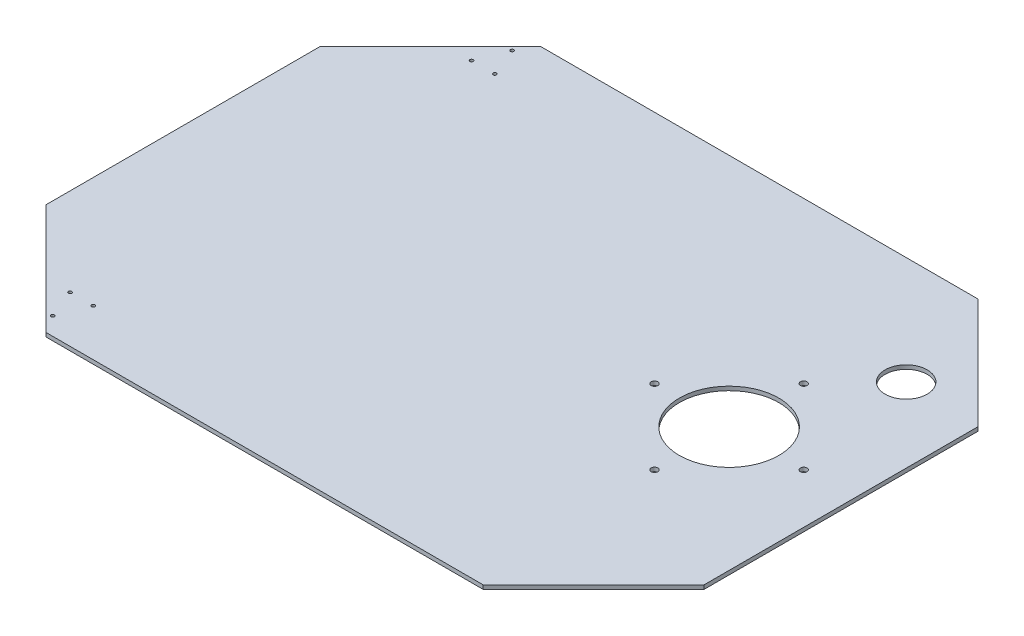
ISO-10303-21;
HEADER;
FILE_DESCRIPTION(('STEP AP214'),'2;1');
FILE_NAME('part.step','',(''),(''),'','','');
FILE_SCHEMA(('AUTOMOTIVE_DESIGN { 1 0 10303 214 1 1 1 1 }'));
ENDSEC;
DATA;
#1=APPLICATION_CONTEXT('core data for automotive mechanical design processes');
#2=APPLICATION_PROTOCOL_DEFINITION('international standard','automotive_design',2000,#1);
#3=PRODUCT_CONTEXT('',#1,'mechanical');
#4=PRODUCT('Part','Part','',(#3));
#5=PRODUCT_RELATED_PRODUCT_CATEGORY('part','',(#4));
#6=PRODUCT_DEFINITION_FORMATION('','',#4);
#7=PRODUCT_DEFINITION_CONTEXT('part definition',#1,'design');
#8=PRODUCT_DEFINITION('design','',#6,#7);
#9=PRODUCT_DEFINITION_SHAPE('','',#8);
#10=(LENGTH_UNIT() NAMED_UNIT(*) SI_UNIT(.MILLI.,.METRE.));
#11=(NAMED_UNIT(*) PLANE_ANGLE_UNIT() SI_UNIT($,.RADIAN.));
#12=(NAMED_UNIT(*) SI_UNIT($,.STERADIAN.) SOLID_ANGLE_UNIT());
#13=UNCERTAINTY_MEASURE_WITH_UNIT(LENGTH_MEASURE(1.E-05),#10,'distance_accuracy_value','');
#14=(GEOMETRIC_REPRESENTATION_CONTEXT(3) GLOBAL_UNCERTAINTY_ASSIGNED_CONTEXT((#13)) GLOBAL_UNIT_ASSIGNED_CONTEXT((#10,
#11,#12)) REPRESENTATION_CONTEXT('',''));
#15=CARTESIAN_POINT('',(0.,0.,0.));
#16=DIRECTION('',(0.,0.,1.));
#17=DIRECTION('',(1.,0.,0.));
#18=AXIS2_PLACEMENT_3D('',#15,#16,#17);
#19=CARTESIAN_POINT('',(-198.4375,2.38125,-149.225));
#20=DIRECTION('',(1.,0.,0.));
#21=DIRECTION('',(0.,0.,-1.));
#22=AXIS2_PLACEMENT_3D('',#19,#20,#21);
#23=PLANE('',#22);
#24=DIRECTION('',(0.,1.,0.));
#25=VECTOR('',#24,1.);
#26=CARTESIAN_POINT('',(-198.4375,-7.61875,-82.55));
#27=LINE('',#26,#25);
#28=CARTESIAN_POINT('',(-198.4375,0.,-82.55));
#29=VERTEX_POINT('',#28);
#30=CARTESIAN_POINT('',(-198.4375,2.38125,-82.55));
#31=VERTEX_POINT('',#30);
#32=EDGE_CURVE('E98',#29,#31,#27,.T.);
#33=ORIENTED_EDGE('',*,*,#32,.F.);
#34=DIRECTION('',(0.,0.,1.));
#35=VECTOR('',#34,1.);
#36=CARTESIAN_POINT('',(-198.4375,0.,-149.225));
#37=LINE('',#36,#35);
#38=CARTESIAN_POINT('',(-198.4375,0.,82.55));
#39=VERTEX_POINT('',#38);
#40=EDGE_CURVE('E57',#29,#39,#37,.T.);
#41=ORIENTED_EDGE('',*,*,#40,.T.);
#42=DIRECTION('',(0.,1.,0.));
#43=VECTOR('',#42,1.);
#44=CARTESIAN_POINT('',(-198.4375,-7.61875,82.55));
#45=LINE('',#44,#43);
#46=CARTESIAN_POINT('',(-198.4375,2.38125,82.55));
#47=VERTEX_POINT('',#46);
#48=EDGE_CURVE('E114',#39,#47,#45,.T.);
#49=ORIENTED_EDGE('',*,*,#48,.T.);
#50=DIRECTION('',(0.,0.,1.));
#51=VECTOR('',#50,1.);
#52=CARTESIAN_POINT('',(-198.4375,2.38125,-149.225));
#53=LINE('',#52,#51);
#54=EDGE_CURVE('E108',#31,#47,#53,.T.);
#55=ORIENTED_EDGE('',*,*,#54,.F.);
#56=EDGE_LOOP('',(#33,#41,#49,#55));
#57=FACE_BOUND('',#56,.T.);
#58=ADVANCED_FACE('F35',(#57),#23,.F.);
#59=CARTESIAN_POINT('',(0.,2.38125,0.));
#60=DIRECTION('',(0.,1.,0.));
#61=DIRECTION('',(0.,0.,1.));
#62=AXIS2_PLACEMENT_3D('',#59,#60,#61);
#63=PLANE('',#62);
#64=CARTESIAN_POINT('',(153.4375,2.38125,-84.225));
#65=DIRECTION('',(0.,1.,0.));
#66=DIRECTION('',(0.,0.,1.));
#67=AXIS2_PLACEMENT_3D('',#64,#65,#66);
#68=CIRCLE('',#67,12.7);
#69=CARTESIAN_POINT('',(153.4375,2.38125,-71.525));
#70=VERTEX_POINT('',#69);
#71=EDGE_CURVE('E155',#70,#70,#68,.T.);
#72=ORIENTED_EDGE('',*,*,#71,.F.);
#73=EDGE_LOOP('',(#72));
#74=FACE_BOUND('',#73,.T.);
#75=CARTESIAN_POINT('',(123.4375,2.38125,-7.47500000000004));
#76=DIRECTION('',(0.,1.,0.));
#77=DIRECTION('',(0.,0.,1.));
#78=AXIS2_PLACEMENT_3D('',#75,#76,#77);
#79=CIRCLE('',#78,30.);
#80=CARTESIAN_POINT('',(123.4375,2.38125,22.525));
#81=VERTEX_POINT('',#80);
#82=EDGE_CURVE('E154',#81,#81,#79,.T.);
#83=ORIENTED_EDGE('',*,*,#82,.F.);
#84=EDGE_LOOP('',(#83));
#85=FACE_BOUND('',#84,.T.);
#86=CARTESIAN_POINT('',(78.4375,2.38125,-7.47500000000004));
#87=DIRECTION('',(0.,1.,0.));
#88=DIRECTION('',(0.,0.,1.));
#89=AXIS2_PLACEMENT_3D('',#86,#87,#88);
#90=CIRCLE('',#89,2.);
#91=CARTESIAN_POINT('',(78.4375,2.38125,-5.47500000000004));
#92=VERTEX_POINT('',#91);
#93=EDGE_CURVE('E195',#92,#92,#90,.T.);
#94=ORIENTED_EDGE('',*,*,#93,.F.);
#95=EDGE_LOOP('',(#94));
#96=FACE_BOUND('',#95,.T.);
#97=CARTESIAN_POINT('',(168.4375,2.38125,-7.47500000000004));
#98=DIRECTION('',(0.,1.,0.));
#99=DIRECTION('',(0.,0.,1.));
#100=AXIS2_PLACEMENT_3D('',#97,#98,#99);
#101=CIRCLE('',#100,2.);
#102=CARTESIAN_POINT('',(168.4375,2.38125,-5.47500000000004));
#103=VERTEX_POINT('',#102);
#104=EDGE_CURVE('E198',#103,#103,#101,.T.);
#105=ORIENTED_EDGE('',*,*,#104,.F.);
#106=EDGE_LOOP('',(#105));
#107=FACE_BOUND('',#106,.T.);
#108=CARTESIAN_POINT('',(123.4375,2.38125,-52.475));
#109=DIRECTION('',(0.,1.,0.));
#110=DIRECTION('',(0.,0.,1.));
#111=AXIS2_PLACEMENT_3D('',#108,#109,#110);
#112=CIRCLE('',#111,2.);
#113=CARTESIAN_POINT('',(123.4375,2.38125,-50.475));
#114=VERTEX_POINT('',#113);
#115=EDGE_CURVE('E142',#114,#114,#112,.T.);
#116=ORIENTED_EDGE('',*,*,#115,.F.);
#117=EDGE_LOOP('',(#116));
#118=FACE_BOUND('',#117,.T.);
#119=CARTESIAN_POINT('',(123.4375,2.38125,37.525));
#120=DIRECTION('',(0.,1.,0.));
#121=DIRECTION('',(0.,0.,1.));
#122=AXIS2_PLACEMENT_3D('',#119,#120,#121);
#123=CIRCLE('',#122,2.);
#124=CARTESIAN_POINT('',(123.4375,2.38125,39.525));
#125=VERTEX_POINT('',#124);
#126=EDGE_CURVE('E137',#125,#125,#123,.T.);
#127=ORIENTED_EDGE('',*,*,#126,.F.);
#128=EDGE_LOOP('',(#127));
#129=FACE_BOUND('',#128,.T.);
#130=CARTESIAN_POINT('',(-145.4375,2.38125,-121.05));
#131=DIRECTION('',(0.,1.,0.));
#132=DIRECTION('',(0.,0.,1.));
#133=AXIS2_PLACEMENT_3D('',#130,#131,#132);
#134=CIRCLE('',#133,0.999999999999998);
#135=CARTESIAN_POINT('',(-145.4375,2.38125,-120.05));
#136=VERTEX_POINT('',#135);
#137=EDGE_CURVE('E233',#136,#136,#134,.T.);
#138=ORIENTED_EDGE('',*,*,#137,.F.);
#139=EDGE_LOOP('',(#138));
#140=FACE_BOUND('',#139,.T.);
#141=CARTESIAN_POINT('',(-145.4375,2.38125,121.05));
#142=DIRECTION('',(0.,1.,0.));
#143=DIRECTION('',(0.,0.,1.));
#144=AXIS2_PLACEMENT_3D('',#141,#142,#143);
#145=CIRCLE('',#144,0.999999999999998);
#146=CARTESIAN_POINT('',(-145.4375,2.38125,122.05));
#147=VERTEX_POINT('',#146);
#148=EDGE_CURVE('E230',#147,#147,#145,.T.);
#149=ORIENTED_EDGE('',*,*,#148,.F.);
#150=EDGE_LOOP('',(#149));
#151=FACE_BOUND('',#150,.T.);
#152=CARTESIAN_POINT('',(-131.4375,2.38125,121.05));
#153=DIRECTION('',(0.,1.,0.));
#154=DIRECTION('',(0.,0.,1.));
#155=AXIS2_PLACEMENT_3D('',#152,#153,#154);
#156=CIRCLE('',#155,0.999999999999998);
#157=CARTESIAN_POINT('',(-131.4375,2.38125,122.05));
#158=VERTEX_POINT('',#157);
#159=EDGE_CURVE('E227',#158,#158,#156,.T.);
#160=ORIENTED_EDGE('',*,*,#159,.F.);
#161=EDGE_LOOP('',(#160));
#162=FACE_BOUND('',#161,.T.);
#163=CARTESIAN_POINT('',(-131.4375,2.38125,-121.05));
#164=DIRECTION('',(0.,1.,0.));
#165=DIRECTION('',(0.,0.,1.));
#166=AXIS2_PLACEMENT_3D('',#163,#164,#165);
#167=CIRCLE('',#166,0.999999999999998);
#168=CARTESIAN_POINT('',(-131.4375,2.38125,-120.05));
#169=VERTEX_POINT('',#168);
#170=EDGE_CURVE('E224',#169,#169,#167,.T.);
#171=ORIENTED_EDGE('',*,*,#170,.F.);
#172=EDGE_LOOP('',(#171));
#173=FACE_BOUND('',#172,.T.);
#174=CARTESIAN_POINT('',(-138.4375,2.38125,-138.55));
#175=DIRECTION('',(0.,1.,0.));
#176=DIRECTION('',(0.,0.,1.));
#177=AXIS2_PLACEMENT_3D('',#174,#175,#176);
#178=CIRCLE('',#177,0.999999999999998);
#179=CARTESIAN_POINT('',(-138.4375,2.38125,-137.55));
#180=VERTEX_POINT('',#179);
#181=EDGE_CURVE('E219',#180,#180,#178,.T.);
#182=ORIENTED_EDGE('',*,*,#181,.F.);
#183=EDGE_LOOP('',(#182));
#184=FACE_BOUND('',#183,.T.);
#185=CARTESIAN_POINT('',(-138.4375,2.38125,138.55));
#186=DIRECTION('',(0.,1.,0.));
#187=DIRECTION('',(0.,0.,1.));
#188=AXIS2_PLACEMENT_3D('',#185,#186,#187);
#189=CIRCLE('',#188,0.999999999999998);
#190=CARTESIAN_POINT('',(-138.4375,2.38125,139.55));
#191=VERTEX_POINT('',#190);
#192=EDGE_CURVE('E127',#191,#191,#189,.T.);
#193=ORIENTED_EDGE('',*,*,#192,.F.);
#194=EDGE_LOOP('',(#193));
#195=FACE_BOUND('',#194,.T.);
#196=DIRECTION('',(-1.,0.,0.));
#197=VECTOR('',#196,1.);
#198=CARTESIAN_POINT('',(-198.4375,2.38125,-149.225));
#199=LINE('',#198,#197);
#200=CARTESIAN_POINT('',(131.762499999999,2.38125,-149.225));
#201=VERTEX_POINT('',#200);
#202=CARTESIAN_POINT('',(-131.762499999999,2.38125,-149.225));
#203=VERTEX_POINT('',#202);
#204=EDGE_CURVE('E112',#201,#203,#199,.T.);
#205=ORIENTED_EDGE('',*,*,#204,.T.);
#206=DIRECTION('',(-0.707106781186552,0.,0.707106781186543));
#207=VECTOR('',#206,1.);
#208=CARTESIAN_POINT('',(-131.762499999999,2.38125,-149.225));
#209=LINE('',#208,#207);
#210=EDGE_CURVE('E49',#203,#31,#209,.T.);
#211=ORIENTED_EDGE('',*,*,#210,.T.);
#212=ORIENTED_EDGE('',*,*,#54,.T.);
#213=DIRECTION('',(0.707106781186546,0.,0.707106781186548));
#214=VECTOR('',#213,1.);
#215=CARTESIAN_POINT('',(-131.7625,2.38125,149.225));
#216=LINE('',#215,#214);
#217=CARTESIAN_POINT('',(-131.7625,2.38125,149.225));
#218=VERTEX_POINT('',#217);
#219=EDGE_CURVE('E172',#47,#218,#216,.T.);
#220=ORIENTED_EDGE('',*,*,#219,.T.);
#221=DIRECTION('',(1.,0.,0.));
#222=VECTOR('',#221,1.);
#223=CARTESIAN_POINT('',(-198.4375,2.38125,149.225));
#224=LINE('',#223,#222);
#225=CARTESIAN_POINT('',(131.7625,2.38125,149.225));
#226=VERTEX_POINT('',#225);
#227=EDGE_CURVE('E115',#218,#226,#224,.T.);
#228=ORIENTED_EDGE('',*,*,#227,.T.);
#229=DIRECTION('',(-0.707106781186546,0.,0.707106781186548));
#230=VECTOR('',#229,1.);
#231=CARTESIAN_POINT('',(131.7625,2.38125,149.225));
#232=LINE('',#231,#230);
#233=CARTESIAN_POINT('',(198.4375,2.38125,82.55));
#234=VERTEX_POINT('',#233);
#235=EDGE_CURVE('E187',#234,#226,#232,.T.);
#236=ORIENTED_EDGE('',*,*,#235,.F.);
#237=DIRECTION('',(0.,0.,-1.));
#238=VECTOR('',#237,1.);
#239=CARTESIAN_POINT('',(198.4375,2.38125,-149.225));
#240=LINE('',#239,#238);
#241=CARTESIAN_POINT('',(198.4375,2.38125,-82.55));
#242=VERTEX_POINT('',#241);
#243=EDGE_CURVE('E119',#234,#242,#240,.T.);
#244=ORIENTED_EDGE('',*,*,#243,.T.);
#245=DIRECTION('',(0.707106781186552,0.,0.707106781186543));
#246=VECTOR('',#245,1.);
#247=CARTESIAN_POINT('',(131.762499999999,2.38125,-149.225));
#248=LINE('',#247,#246);
#249=EDGE_CURVE('E240',#201,#242,#248,.T.);
#250=ORIENTED_EDGE('',*,*,#249,.F.);
#251=EDGE_LOOP('',(#205,#211,#212,#220,#228,#236,#244,#250));
#252=FACE_BOUND('',#251,.T.);
#253=ADVANCED_FACE('F106',(#74,#85,#96,#107,#118,#129,#140,#151,#162,#173,#184,#195,#252),#63,.T.);
#254=CARTESIAN_POINT('',(0.,0.,0.));
#255=DIRECTION('',(0.,1.,0.));
#256=DIRECTION('',(0.,0.,1.));
#257=AXIS2_PLACEMENT_3D('',#254,#255,#256);
#258=PLANE('',#257);
#259=CARTESIAN_POINT('',(153.4375,0.,-84.225));
#260=DIRECTION('',(0.,1.,0.));
#261=DIRECTION('',(0.,0.,1.));
#262=AXIS2_PLACEMENT_3D('',#259,#260,#261);
#263=CIRCLE('',#262,12.7);
#264=CARTESIAN_POINT('',(153.4375,0.,-71.525));
#265=VERTEX_POINT('',#264);
#266=EDGE_CURVE('E151',#265,#265,#263,.T.);
#267=ORIENTED_EDGE('',*,*,#266,.T.);
#268=EDGE_LOOP('',(#267));
#269=FACE_BOUND('',#268,.T.);
#270=CARTESIAN_POINT('',(123.4375,0.,-7.47500000000004));
#271=DIRECTION('',(0.,1.,0.));
#272=DIRECTION('',(0.,0.,1.));
#273=AXIS2_PLACEMENT_3D('',#270,#271,#272);
#274=CIRCLE('',#273,30.);
#275=CARTESIAN_POINT('',(123.4375,0.,22.525));
#276=VERTEX_POINT('',#275);
#277=EDGE_CURVE('E148',#276,#276,#274,.T.);
#278=ORIENTED_EDGE('',*,*,#277,.T.);
#279=EDGE_LOOP('',(#278));
#280=FACE_BOUND('',#279,.T.);
#281=CARTESIAN_POINT('',(78.4375,0.,-7.47500000000004));
#282=DIRECTION('',(0.,1.,0.));
#283=DIRECTION('',(0.,0.,1.));
#284=AXIS2_PLACEMENT_3D('',#281,#282,#283);
#285=CIRCLE('',#284,2.);
#286=CARTESIAN_POINT('',(78.4375,0.,-5.47500000000004));
#287=VERTEX_POINT('',#286);
#288=EDGE_CURVE('E145',#287,#287,#285,.T.);
#289=ORIENTED_EDGE('',*,*,#288,.T.);
#290=EDGE_LOOP('',(#289));
#291=FACE_BOUND('',#290,.T.);
#292=CARTESIAN_POINT('',(168.4375,0.,-7.47500000000004));
#293=DIRECTION('',(0.,1.,0.));
#294=DIRECTION('',(0.,0.,1.));
#295=AXIS2_PLACEMENT_3D('',#292,#293,#294);
#296=CIRCLE('',#295,2.);
#297=CARTESIAN_POINT('',(168.4375,0.,-5.47500000000004));
#298=VERTEX_POINT('',#297);
#299=EDGE_CURVE('E141',#298,#298,#296,.T.);
#300=ORIENTED_EDGE('',*,*,#299,.T.);
#301=EDGE_LOOP('',(#300));
#302=FACE_BOUND('',#301,.T.);
#303=CARTESIAN_POINT('',(123.4375,0.,-52.475));
#304=DIRECTION('',(0.,1.,0.));
#305=DIRECTION('',(0.,0.,1.));
#306=AXIS2_PLACEMENT_3D('',#303,#304,#305);
#307=CIRCLE('',#306,2.);
#308=CARTESIAN_POINT('',(123.4375,0.,-50.475));
#309=VERTEX_POINT('',#308);
#310=EDGE_CURVE('E138',#309,#309,#307,.T.);
#311=ORIENTED_EDGE('',*,*,#310,.T.);
#312=EDGE_LOOP('',(#311));
#313=FACE_BOUND('',#312,.T.);
#314=CARTESIAN_POINT('',(123.4375,0.,37.525));
#315=DIRECTION('',(0.,1.,0.));
#316=DIRECTION('',(0.,0.,1.));
#317=AXIS2_PLACEMENT_3D('',#314,#315,#316);
#318=CIRCLE('',#317,2.);
#319=CARTESIAN_POINT('',(123.4375,0.,39.525));
#320=VERTEX_POINT('',#319);
#321=EDGE_CURVE('E133',#320,#320,#318,.T.);
#322=ORIENTED_EDGE('',*,*,#321,.T.);
#323=EDGE_LOOP('',(#322));
#324=FACE_BOUND('',#323,.T.);
#325=CARTESIAN_POINT('',(-145.4375,0.,-121.05));
#326=DIRECTION('',(0.,-1.,0.));
#327=DIRECTION('',(0.,0.,-1.));
#328=AXIS2_PLACEMENT_3D('',#325,#326,#327);
#329=CIRCLE('',#328,0.999999999999998);
#330=CARTESIAN_POINT('',(-145.4375,0.,-122.05));
#331=VERTEX_POINT('',#330);
#332=EDGE_CURVE('E136',#331,#331,#329,.T.);
#333=ORIENTED_EDGE('',*,*,#332,.F.);
#334=EDGE_LOOP('',(#333));
#335=FACE_BOUND('',#334,.T.);
#336=CARTESIAN_POINT('',(-145.4375,0.,121.05));
#337=DIRECTION('',(0.,-1.,0.));
#338=DIRECTION('',(0.,0.,-1.));
#339=AXIS2_PLACEMENT_3D('',#336,#337,#338);
#340=CIRCLE('',#339,0.999999999999998);
#341=CARTESIAN_POINT('',(-145.4375,0.,120.05));
#342=VERTEX_POINT('',#341);
#343=EDGE_CURVE('E211',#342,#342,#340,.T.);
#344=ORIENTED_EDGE('',*,*,#343,.F.);
#345=EDGE_LOOP('',(#344));
#346=FACE_BOUND('',#345,.T.);
#347=CARTESIAN_POINT('',(-131.4375,0.,121.05));
#348=DIRECTION('',(0.,-1.,0.));
#349=DIRECTION('',(0.,0.,-1.));
#350=AXIS2_PLACEMENT_3D('',#347,#348,#349);
#351=CIRCLE('',#350,0.999999999999998);
#352=CARTESIAN_POINT('',(-131.4375,0.,120.05));
#353=VERTEX_POINT('',#352);
#354=EDGE_CURVE('E207',#353,#353,#351,.T.);
#355=ORIENTED_EDGE('',*,*,#354,.F.);
#356=EDGE_LOOP('',(#355));
#357=FACE_BOUND('',#356,.T.);
#358=CARTESIAN_POINT('',(-131.4375,0.,-121.05));
#359=DIRECTION('',(0.,-1.,0.));
#360=DIRECTION('',(0.,0.,-1.));
#361=AXIS2_PLACEMENT_3D('',#358,#359,#360);
#362=CIRCLE('',#361,0.999999999999998);
#363=CARTESIAN_POINT('',(-131.4375,0.,-122.05));
#364=VERTEX_POINT('',#363);
#365=EDGE_CURVE('E210',#364,#364,#362,.T.);
#366=ORIENTED_EDGE('',*,*,#365,.F.);
#367=EDGE_LOOP('',(#366));
#368=FACE_BOUND('',#367,.T.);
#369=CARTESIAN_POINT('',(-138.4375,0.,-138.55));
#370=DIRECTION('',(0.,-1.,0.));
#371=DIRECTION('',(0.,0.,-1.));
#372=AXIS2_PLACEMENT_3D('',#369,#370,#371);
#373=CIRCLE('',#372,0.999999999999998);
#374=CARTESIAN_POINT('',(-138.4375,0.,-139.55));
#375=VERTEX_POINT('',#374);
#376=EDGE_CURVE('E216',#375,#375,#373,.T.);
#377=ORIENTED_EDGE('',*,*,#376,.F.);
#378=EDGE_LOOP('',(#377));
#379=FACE_BOUND('',#378,.T.);
#380=CARTESIAN_POINT('',(-138.4375,0.,138.55));
#381=DIRECTION('',(0.,-1.,0.));
#382=DIRECTION('',(0.,0.,-1.));
#383=AXIS2_PLACEMENT_3D('',#380,#381,#382);
#384=CIRCLE('',#383,0.999999999999998);
#385=CARTESIAN_POINT('',(-138.4375,0.,137.55));
#386=VERTEX_POINT('',#385);
#387=EDGE_CURVE('E236',#386,#386,#384,.T.);
#388=ORIENTED_EDGE('',*,*,#387,.F.);
#389=EDGE_LOOP('',(#388));
#390=FACE_BOUND('',#389,.T.);
#391=DIRECTION('',(-0.707106781186552,0.,0.707106781186543));
#392=VECTOR('',#391,1.);
#393=CARTESIAN_POINT('',(-140.493749999999,0.,-140.493750000001));
#394=LINE('',#393,#392);
#395=CARTESIAN_POINT('',(-131.762499999999,0.,-149.225));
#396=VERTEX_POINT('',#395);
#397=EDGE_CURVE('E101',#396,#29,#394,.T.);
#398=ORIENTED_EDGE('',*,*,#397,.F.);
#399=DIRECTION('',(-1.,0.,0.));
#400=VECTOR('',#399,1.);
#401=CARTESIAN_POINT('',(-198.4375,0.,-149.225));
#402=LINE('',#401,#400);
#403=CARTESIAN_POINT('',(131.762499999999,0.,-149.225));
#404=VERTEX_POINT('',#403);
#405=EDGE_CURVE('E126',#404,#396,#402,.T.);
#406=ORIENTED_EDGE('',*,*,#405,.F.);
#407=DIRECTION('',(0.707106781186552,0.,0.707106781186543));
#408=VECTOR('',#407,1.);
#409=CARTESIAN_POINT('',(140.493749999999,0.,-140.493750000001));
#410=LINE('',#409,#408);
#411=CARTESIAN_POINT('',(198.4375,0.,-82.5500000000002));
#412=VERTEX_POINT('',#411);
#413=EDGE_CURVE('E158',#404,#412,#410,.T.);
#414=ORIENTED_EDGE('',*,*,#413,.T.);
#415=DIRECTION('',(0.,0.,-1.));
#416=VECTOR('',#415,1.);
#417=CARTESIAN_POINT('',(198.4375,0.,-149.225));
#418=LINE('',#417,#416);
#419=CARTESIAN_POINT('',(198.4375,0.,82.55));
#420=VERTEX_POINT('',#419);
#421=EDGE_CURVE('E123',#420,#412,#418,.T.);
#422=ORIENTED_EDGE('',*,*,#421,.F.);
#423=DIRECTION('',(-0.707106781186547,0.,0.707106781186548));
#424=VECTOR('',#423,1.);
#425=CARTESIAN_POINT('',(140.49375,0.,140.49375));
#426=LINE('',#425,#424);
#427=CARTESIAN_POINT('',(131.7625,0.,149.225));
#428=VERTEX_POINT('',#427);
#429=EDGE_CURVE('E117',#420,#428,#426,.T.);
#430=ORIENTED_EDGE('',*,*,#429,.T.);
#431=DIRECTION('',(1.,0.,0.));
#432=VECTOR('',#431,1.);
#433=CARTESIAN_POINT('',(-198.4375,0.,149.225));
#434=LINE('',#433,#432);
#435=CARTESIAN_POINT('',(-131.7625,0.,149.225));
#436=VERTEX_POINT('',#435);
#437=EDGE_CURVE('E131',#436,#428,#434,.T.);
#438=ORIENTED_EDGE('',*,*,#437,.F.);
#439=DIRECTION('',(0.707106781186547,0.,0.707106781186548));
#440=VECTOR('',#439,1.);
#441=CARTESIAN_POINT('',(-140.49375,0.,140.49375));
#442=LINE('',#441,#440);
#443=EDGE_CURVE('E43',#39,#436,#442,.T.);
#444=ORIENTED_EDGE('',*,*,#443,.F.);
#445=ORIENTED_EDGE('',*,*,#40,.F.);
#446=EDGE_LOOP('',(#398,#406,#414,#422,#430,#438,#444,#445));
#447=FACE_BOUND('',#446,.T.);
#448=ADVANCED_FACE('F174',(#269,#280,#291,#302,#313,#324,#335,#346,#357,#368,#379,#390,#447),
#258,.F.);
#449=CARTESIAN_POINT('',(-198.4375,2.38125,-149.225));
#450=DIRECTION('',(0.,0.,1.));
#451=DIRECTION('',(1.,0.,0.));
#452=AXIS2_PLACEMENT_3D('',#449,#450,#451);
#453=PLANE('',#452);
#454=DIRECTION('',(0.,-1.,0.));
#455=VECTOR('',#454,1.);
#456=CARTESIAN_POINT('',(-131.762499999999,2.38125,-149.225));
#457=LINE('',#456,#455);
#458=EDGE_CURVE('E11',#203,#396,#457,.T.);
#459=ORIENTED_EDGE('',*,*,#458,.F.);
#460=ORIENTED_EDGE('',*,*,#204,.F.);
#461=DIRECTION('',(0.,1.,0.));
#462=VECTOR('',#461,1.);
#463=CARTESIAN_POINT('',(131.762499999999,-7.61875,-149.225));
#464=LINE('',#463,#462);
#465=EDGE_CURVE('E246',#404,#201,#464,.T.);
#466=ORIENTED_EDGE('',*,*,#465,.F.);
#467=ORIENTED_EDGE('',*,*,#405,.T.);
#468=EDGE_LOOP('',(#459,#460,#466,#467));
#469=FACE_BOUND('',#468,.T.);
#470=ADVANCED_FACE('F253',(#469),#453,.F.);
#471=CARTESIAN_POINT('',(-198.4375,2.38125,149.225));
#472=DIRECTION('',(0.,0.,-1.));
#473=DIRECTION('',(-1.,0.,0.));
#474=AXIS2_PLACEMENT_3D('',#471,#472,#473);
#475=PLANE('',#474);
#476=DIRECTION('',(0.,1.,0.));
#477=VECTOR('',#476,1.);
#478=CARTESIAN_POINT('',(-131.7625,-7.61875,149.225));
#479=LINE('',#478,#477);
#480=EDGE_CURVE('E164',#436,#218,#479,.T.);
#481=ORIENTED_EDGE('',*,*,#480,.F.);
#482=ORIENTED_EDGE('',*,*,#437,.T.);
#483=DIRECTION('',(0.,1.,0.));
#484=VECTOR('',#483,1.);
#485=CARTESIAN_POINT('',(131.7625,-7.61875,149.225));
#486=LINE('',#485,#484);
#487=EDGE_CURVE('E182',#428,#226,#486,.T.);
#488=ORIENTED_EDGE('',*,*,#487,.T.);
#489=ORIENTED_EDGE('',*,*,#227,.F.);
#490=EDGE_LOOP('',(#481,#482,#488,#489));
#491=FACE_BOUND('',#490,.T.);
#492=ADVANCED_FACE('F169',(#491),#475,.F.);
#493=CARTESIAN_POINT('',(198.4375,2.38125,-149.225));
#494=DIRECTION('',(-1.,0.,0.));
#495=DIRECTION('',(0.,0.,1.));
#496=AXIS2_PLACEMENT_3D('',#493,#494,#495);
#497=PLANE('',#496);
#498=ORIENTED_EDGE('',*,*,#421,.T.);
#499=DIRECTION('',(0.,1.,0.));
#500=VECTOR('',#499,1.);
#501=CARTESIAN_POINT('',(198.4375,-7.61875,-82.55));
#502=LINE('',#501,#500);
#503=EDGE_CURVE('E190',#412,#242,#502,.T.);
#504=ORIENTED_EDGE('',*,*,#503,.T.);
#505=ORIENTED_EDGE('',*,*,#243,.F.);
#506=DIRECTION('',(0.,1.,0.));
#507=VECTOR('',#506,1.);
#508=CARTESIAN_POINT('',(198.4375,-7.61875,82.55));
#509=LINE('',#508,#507);
#510=EDGE_CURVE('E180',#420,#234,#509,.T.);
#511=ORIENTED_EDGE('',*,*,#510,.F.);
#512=EDGE_LOOP('',(#498,#504,#505,#511));
#513=FACE_BOUND('',#512,.T.);
#514=ADVANCED_FACE('F37',(#513),#497,.F.);
#515=CARTESIAN_POINT('',(-138.4375,10.,138.55));
#516=DIRECTION('',(0.,-1.,0.));
#517=DIRECTION('',(0.,0.,-1.));
#518=AXIS2_PLACEMENT_3D('',#515,#516,#517);
#519=CYLINDRICAL_SURFACE('',#518,0.999999999999998);
#520=ORIENTED_EDGE('',*,*,#192,.T.);
#521=EDGE_LOOP('',(#520));
#522=FACE_BOUND('',#521,.T.);
#523=ORIENTED_EDGE('',*,*,#387,.T.);
#524=EDGE_LOOP('',(#523));
#525=FACE_BOUND('',#524,.T.);
#526=ADVANCED_FACE('F270',(#522,#525),#519,.F.);
#527=CARTESIAN_POINT('',(-138.4375,10.,-138.55));
#528=DIRECTION('',(0.,-1.,0.));
#529=DIRECTION('',(0.,0.,-1.));
#530=AXIS2_PLACEMENT_3D('',#527,#528,#529);
#531=CYLINDRICAL_SURFACE('',#530,0.999999999999998);
#532=ORIENTED_EDGE('',*,*,#181,.T.);
#533=EDGE_LOOP('',(#532));
#534=FACE_BOUND('',#533,.T.);
#535=ORIENTED_EDGE('',*,*,#376,.T.);
#536=EDGE_LOOP('',(#535));
#537=FACE_BOUND('',#536,.T.);
#538=ADVANCED_FACE('F273',(#534,#537),#531,.F.);
#539=CARTESIAN_POINT('',(-131.4375,10.,-121.05));
#540=DIRECTION('',(0.,-1.,0.));
#541=DIRECTION('',(0.,0.,-1.));
#542=AXIS2_PLACEMENT_3D('',#539,#540,#541);
#543=CYLINDRICAL_SURFACE('',#542,0.999999999999998);
#544=ORIENTED_EDGE('',*,*,#170,.T.);
#545=EDGE_LOOP('',(#544));
#546=FACE_BOUND('',#545,.T.);
#547=ORIENTED_EDGE('',*,*,#365,.T.);
#548=EDGE_LOOP('',(#547));
#549=FACE_BOUND('',#548,.T.);
#550=ADVANCED_FACE('F275',(#546,#549),#543,.F.);
#551=CARTESIAN_POINT('',(-131.4375,10.,121.05));
#552=DIRECTION('',(0.,-1.,0.));
#553=DIRECTION('',(0.,0.,-1.));
#554=AXIS2_PLACEMENT_3D('',#551,#552,#553);
#555=CYLINDRICAL_SURFACE('',#554,0.999999999999998);
#556=ORIENTED_EDGE('',*,*,#159,.T.);
#557=EDGE_LOOP('',(#556));
#558=FACE_BOUND('',#557,.T.);
#559=ORIENTED_EDGE('',*,*,#354,.T.);
#560=EDGE_LOOP('',(#559));
#561=FACE_BOUND('',#560,.T.);
#562=ADVANCED_FACE('F278',(#558,#561),#555,.F.);
#563=CARTESIAN_POINT('',(-145.4375,10.,121.05));
#564=DIRECTION('',(0.,-1.,0.));
#565=DIRECTION('',(0.,0.,-1.));
#566=AXIS2_PLACEMENT_3D('',#563,#564,#565);
#567=CYLINDRICAL_SURFACE('',#566,0.999999999999998);
#568=ORIENTED_EDGE('',*,*,#148,.T.);
#569=EDGE_LOOP('',(#568));
#570=FACE_BOUND('',#569,.T.);
#571=ORIENTED_EDGE('',*,*,#343,.T.);
#572=EDGE_LOOP('',(#571));
#573=FACE_BOUND('',#572,.T.);
#574=ADVANCED_FACE('F287',(#570,#573),#567,.F.);
#575=CARTESIAN_POINT('',(-145.4375,10.,-121.05));
#576=DIRECTION('',(0.,-1.,0.));
#577=DIRECTION('',(0.,0.,-1.));
#578=AXIS2_PLACEMENT_3D('',#575,#576,#577);
#579=CYLINDRICAL_SURFACE('',#578,0.999999999999998);
#580=ORIENTED_EDGE('',*,*,#137,.T.);
#581=EDGE_LOOP('',(#580));
#582=FACE_BOUND('',#581,.T.);
#583=ORIENTED_EDGE('',*,*,#332,.T.);
#584=EDGE_LOOP('',(#583));
#585=FACE_BOUND('',#584,.T.);
#586=ADVANCED_FACE('F283',(#582,#585),#579,.F.);
#587=CARTESIAN_POINT('',(123.4375,-7.61875,37.525));
#588=DIRECTION('',(0.,1.,0.));
#589=DIRECTION('',(0.,0.,1.));
#590=AXIS2_PLACEMENT_3D('',#587,#588,#589);
#591=CYLINDRICAL_SURFACE('',#590,2.);
#592=ORIENTED_EDGE('',*,*,#126,.T.);
#593=EDGE_LOOP('',(#592));
#594=FACE_BOUND('',#593,.T.);
#595=ORIENTED_EDGE('',*,*,#321,.F.);
#596=EDGE_LOOP('',(#595));
#597=FACE_BOUND('',#596,.T.);
#598=ADVANCED_FACE('F286',(#594,#597),#591,.F.);
#599=CARTESIAN_POINT('',(123.4375,-7.61875,-52.475));
#600=DIRECTION('',(0.,1.,0.));
#601=DIRECTION('',(0.,0.,1.));
#602=AXIS2_PLACEMENT_3D('',#599,#600,#601);
#603=CYLINDRICAL_SURFACE('',#602,2.);
#604=ORIENTED_EDGE('',*,*,#115,.T.);
#605=EDGE_LOOP('',(#604));
#606=FACE_BOUND('',#605,.T.);
#607=ORIENTED_EDGE('',*,*,#310,.F.);
#608=EDGE_LOOP('',(#607));
#609=FACE_BOUND('',#608,.T.);
#610=ADVANCED_FACE('F297',(#606,#609),#603,.F.);
#611=CARTESIAN_POINT('',(168.4375,-7.61875,-7.47500000000004));
#612=DIRECTION('',(0.,1.,0.));
#613=DIRECTION('',(0.,0.,1.));
#614=AXIS2_PLACEMENT_3D('',#611,#612,#613);
#615=CYLINDRICAL_SURFACE('',#614,2.);
#616=ORIENTED_EDGE('',*,*,#104,.T.);
#617=EDGE_LOOP('',(#616));
#618=FACE_BOUND('',#617,.T.);
#619=ORIENTED_EDGE('',*,*,#299,.F.);
#620=EDGE_LOOP('',(#619));
#621=FACE_BOUND('',#620,.T.);
#622=ADVANCED_FACE('F299',(#618,#621),#615,.F.);
#623=CARTESIAN_POINT('',(78.4375,-7.61875,-7.47500000000004));
#624=DIRECTION('',(0.,1.,0.));
#625=DIRECTION('',(0.,0.,1.));
#626=AXIS2_PLACEMENT_3D('',#623,#624,#625);
#627=CYLINDRICAL_SURFACE('',#626,2.);
#628=ORIENTED_EDGE('',*,*,#93,.T.);
#629=EDGE_LOOP('',(#628));
#630=FACE_BOUND('',#629,.T.);
#631=ORIENTED_EDGE('',*,*,#288,.F.);
#632=EDGE_LOOP('',(#631));
#633=FACE_BOUND('',#632,.T.);
#634=ADVANCED_FACE('F302',(#630,#633),#627,.F.);
#635=CARTESIAN_POINT('',(123.4375,-7.61875,-7.47500000000004));
#636=DIRECTION('',(0.,1.,0.));
#637=DIRECTION('',(0.,0.,1.));
#638=AXIS2_PLACEMENT_3D('',#635,#636,#637);
#639=CYLINDRICAL_SURFACE('',#638,30.);
#640=ORIENTED_EDGE('',*,*,#82,.T.);
#641=EDGE_LOOP('',(#640));
#642=FACE_BOUND('',#641,.T.);
#643=ORIENTED_EDGE('',*,*,#277,.F.);
#644=EDGE_LOOP('',(#643));
#645=FACE_BOUND('',#644,.T.);
#646=ADVANCED_FACE('F307',(#642,#645),#639,.F.);
#647=CARTESIAN_POINT('',(153.4375,-7.61875,-84.225));
#648=DIRECTION('',(0.,1.,0.));
#649=DIRECTION('',(0.,0.,1.));
#650=AXIS2_PLACEMENT_3D('',#647,#648,#649);
#651=CYLINDRICAL_SURFACE('',#650,12.7);
#652=ORIENTED_EDGE('',*,*,#71,.T.);
#653=EDGE_LOOP('',(#652));
#654=FACE_BOUND('',#653,.T.);
#655=ORIENTED_EDGE('',*,*,#266,.F.);
#656=EDGE_LOOP('',(#655));
#657=FACE_BOUND('',#656,.T.);
#658=ADVANCED_FACE('F310',(#654,#657),#651,.F.);
#659=CARTESIAN_POINT('',(131.7625,-7.61875,149.225));
#660=DIRECTION('',(-0.707106781186548,0.,-0.707106781186547));
#661=DIRECTION('',(-0.707106781186547,0.,0.707106781186548));
#662=AXIS2_PLACEMENT_3D('',#659,#660,#661);
#663=PLANE('',#662);
#664=ORIENTED_EDGE('',*,*,#510,.T.);
#665=ORIENTED_EDGE('',*,*,#235,.T.);
#666=ORIENTED_EDGE('',*,*,#487,.F.);
#667=ORIENTED_EDGE('',*,*,#429,.F.);
#668=EDGE_LOOP('',(#664,#665,#666,#667));
#669=FACE_BOUND('',#668,.T.);
#670=ADVANCED_FACE('F178',(#669),#663,.F.);
#671=CARTESIAN_POINT('',(131.762499999999,-7.61875,-149.225));
#672=DIRECTION('',(-0.707106781186543,0.,0.707106781186552));
#673=DIRECTION('',(0.707106781186552,0.,0.707106781186543));
#674=AXIS2_PLACEMENT_3D('',#671,#672,#673);
#675=PLANE('',#674);
#676=ORIENTED_EDGE('',*,*,#465,.T.);
#677=ORIENTED_EDGE('',*,*,#249,.T.);
#678=ORIENTED_EDGE('',*,*,#503,.F.);
#679=ORIENTED_EDGE('',*,*,#413,.F.);
#680=EDGE_LOOP('',(#676,#677,#678,#679));
#681=FACE_BOUND('',#680,.T.);
#682=ADVANCED_FACE('F250',(#681),#675,.F.);
#683=CARTESIAN_POINT('',(-131.7625,-7.61875,149.225));
#684=DIRECTION('',(-0.707106781186548,0.,0.707106781186547));
#685=DIRECTION('',(0.707106781186547,0.,0.707106781186548));
#686=AXIS2_PLACEMENT_3D('',#683,#684,#685);
#687=PLANE('',#686);
#688=ORIENTED_EDGE('',*,*,#443,.T.);
#689=ORIENTED_EDGE('',*,*,#480,.T.);
#690=ORIENTED_EDGE('',*,*,#219,.F.);
#691=ORIENTED_EDGE('',*,*,#48,.F.);
#692=EDGE_LOOP('',(#688,#689,#690,#691));
#693=FACE_BOUND('',#692,.T.);
#694=ADVANCED_FACE('F163',(#693),#687,.T.);
#695=CARTESIAN_POINT('',(-131.762499999999,-7.61875,-149.225));
#696=DIRECTION('',(-0.707106781186543,0.,-0.707106781186552));
#697=DIRECTION('',(-0.707106781186552,0.,0.707106781186543));
#698=AXIS2_PLACEMENT_3D('',#695,#696,#697);
#699=PLANE('',#698);
#700=ORIENTED_EDGE('',*,*,#397,.T.);
#701=ORIENTED_EDGE('',*,*,#32,.T.);
#702=ORIENTED_EDGE('',*,*,#210,.F.);
#703=ORIENTED_EDGE('',*,*,#458,.T.);
#704=EDGE_LOOP('',(#700,#701,#702,#703));
#705=FACE_BOUND('',#704,.T.);
#706=ADVANCED_FACE('F99',(#705),#699,.T.);
#707=CLOSED_SHELL('',(#58,#253,#448,#470,#492,#514,#526,#538,#550,#562,#574,#586,#598,#610,#622,
#634,#646,#658,#670,#682,#694,#706));
#708=MANIFOLD_SOLID_BREP('B2',#707);
#709=ADVANCED_BREP_SHAPE_REPRESENTATION('',(#18,#708),#14);
#710=SHAPE_DEFINITION_REPRESENTATION(#9,#709);
ENDSEC;
END-ISO-10303-21;
